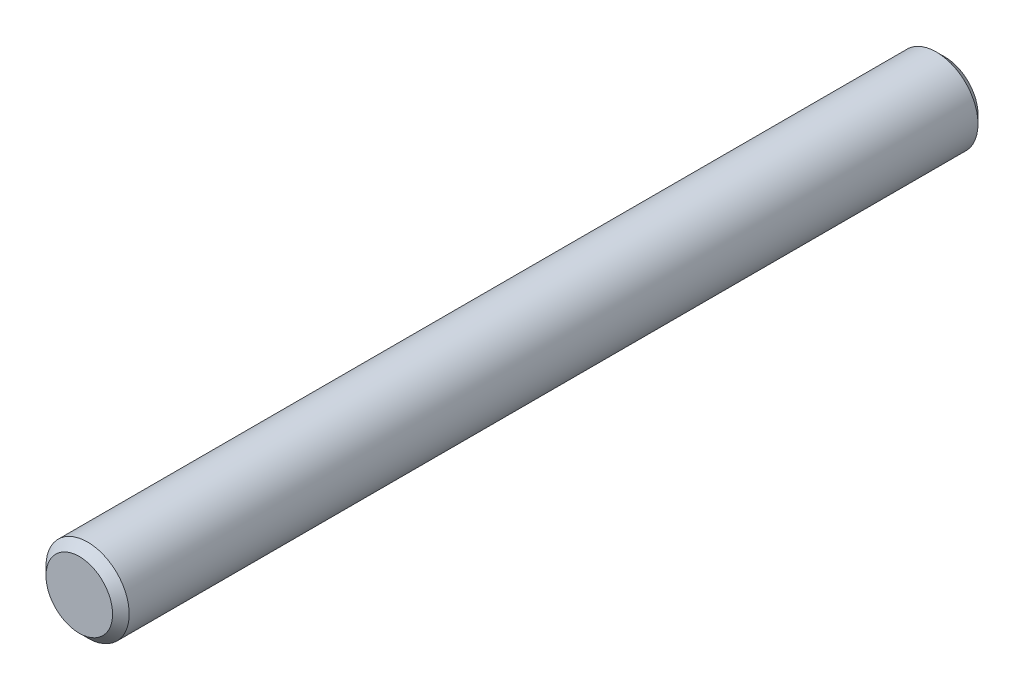
ISO-10303-21;
HEADER;
FILE_DESCRIPTION(('STEP AP214'),'2;1');
FILE_NAME('part.step','',(''),(''),'','','');
FILE_SCHEMA(('AUTOMOTIVE_DESIGN { 1 0 10303 214 1 1 1 1 }'));
ENDSEC;
DATA;
#1=APPLICATION_CONTEXT('core data for automotive mechanical design processes');
#2=APPLICATION_PROTOCOL_DEFINITION('international standard','automotive_design',2000,#1);
#3=PRODUCT_CONTEXT('',#1,'mechanical');
#4=PRODUCT('Part','Part','',(#3));
#5=PRODUCT_RELATED_PRODUCT_CATEGORY('part','',(#4));
#6=PRODUCT_DEFINITION_FORMATION('','',#4);
#7=PRODUCT_DEFINITION_CONTEXT('part definition',#1,'design');
#8=PRODUCT_DEFINITION('design','',#6,#7);
#9=PRODUCT_DEFINITION_SHAPE('','',#8);
#10=(LENGTH_UNIT() NAMED_UNIT(*) SI_UNIT(.MILLI.,.METRE.));
#11=(NAMED_UNIT(*) PLANE_ANGLE_UNIT() SI_UNIT($,.RADIAN.));
#12=(NAMED_UNIT(*) SI_UNIT($,.STERADIAN.) SOLID_ANGLE_UNIT());
#13=UNCERTAINTY_MEASURE_WITH_UNIT(LENGTH_MEASURE(1.E-05),#10,'distance_accuracy_value','');
#14=(GEOMETRIC_REPRESENTATION_CONTEXT(3) GLOBAL_UNCERTAINTY_ASSIGNED_CONTEXT((#13)) GLOBAL_UNIT_ASSIGNED_CONTEXT((#10,
#11,#12)) REPRESENTATION_CONTEXT('',''));
#15=CARTESIAN_POINT('',(0.,0.,0.));
#16=DIRECTION('',(0.,0.,1.));
#17=DIRECTION('',(1.,0.,0.));
#18=AXIS2_PLACEMENT_3D('',#15,#16,#17);
#19=CARTESIAN_POINT('',(0.,0.,52.));
#20=DIRECTION('',(0.,0.,-1.));
#21=DIRECTION('',(-1.,0.,0.));
#22=AXIS2_PLACEMENT_3D('',#19,#20,#21);
#23=CYLINDRICAL_SURFACE('',#22,2.5);
#24=CARTESIAN_POINT('',(0.,0.,51.5));
#25=DIRECTION('',(0.,0.,1.));
#26=DIRECTION('',(1.,0.,0.));
#27=AXIS2_PLACEMENT_3D('',#24,#25,#26);
#28=CIRCLE('',#27,2.5);
#29=CARTESIAN_POINT('',(-2.5,0.,51.5));
#30=VERTEX_POINT('',#29);
#31=EDGE_CURVE('E38',#30,#30,#28,.F.);
#32=CARTESIAN_POINT('',(0.,0.,0.500000000000021));
#33=DIRECTION('',(0.,0.,1.));
#34=DIRECTION('',(1.,0.,0.));
#35=AXIS2_PLACEMENT_3D('',#32,#33,#34);
#36=CIRCLE('',#35,2.5);
#37=CARTESIAN_POINT('',(-2.5,0.,0.500000000000014));
#38=VERTEX_POINT('',#37);
#39=EDGE_CURVE('E42',#38,#38,#36,.T.);
#40=CARTESIAN_POINT('',(-2.5,0.,51.5));
#41=CARTESIAN_POINT('',(-2.5,0.,50.96875));
#42=CARTESIAN_POINT('',(-2.5,0.,50.4375));
#43=CARTESIAN_POINT('',(-2.5,0.,49.375));
#44=CARTESIAN_POINT('',(-2.5,0.,48.84375));
#45=CARTESIAN_POINT('',(-2.5,0.,47.78125));
#46=CARTESIAN_POINT('',(-2.5,0.,47.25));
#47=CARTESIAN_POINT('',(-2.5,0.,46.1875));
#48=CARTESIAN_POINT('',(-2.5,0.,45.65625));
#49=CARTESIAN_POINT('',(-2.5,0.,44.59375));
#50=CARTESIAN_POINT('',(-2.5,0.,44.0625));
#51=CARTESIAN_POINT('',(-2.5,0.,43.));
#52=CARTESIAN_POINT('',(-2.5,0.,42.46875));
#53=CARTESIAN_POINT('',(-2.5,0.,41.40625));
#54=CARTESIAN_POINT('',(-2.5,0.,40.875));
#55=CARTESIAN_POINT('',(-2.5,0.,39.8125));
#56=CARTESIAN_POINT('',(-2.5,0.,39.28125));
#57=CARTESIAN_POINT('',(-2.5,0.,38.21875));
#58=CARTESIAN_POINT('',(-2.5,0.,37.6875));
#59=CARTESIAN_POINT('',(-2.5,0.,36.625));
#60=CARTESIAN_POINT('',(-2.5,0.,36.09375));
#61=CARTESIAN_POINT('',(-2.5,0.,35.03125));
#62=CARTESIAN_POINT('',(-2.5,0.,34.5));
#63=CARTESIAN_POINT('',(-2.5,0.,33.4375));
#64=CARTESIAN_POINT('',(-2.5,0.,32.90625));
#65=CARTESIAN_POINT('',(-2.5,0.,31.84375));
#66=CARTESIAN_POINT('',(-2.5,0.,31.3125));
#67=CARTESIAN_POINT('',(-2.5,0.,30.25));
#68=CARTESIAN_POINT('',(-2.5,0.,29.71875));
#69=CARTESIAN_POINT('',(-2.5,0.,28.65625));
#70=CARTESIAN_POINT('',(-2.5,0.,28.125));
#71=CARTESIAN_POINT('',(-2.5,0.,27.0625));
#72=CARTESIAN_POINT('',(-2.5,0.,26.53125));
#73=CARTESIAN_POINT('',(-2.5,0.,25.46875));
#74=CARTESIAN_POINT('',(-2.5,0.,24.9375));
#75=CARTESIAN_POINT('',(-2.5,0.,23.875));
#76=CARTESIAN_POINT('',(-2.5,0.,23.34375));
#77=CARTESIAN_POINT('',(-2.5,0.,22.28125));
#78=CARTESIAN_POINT('',(-2.5,0.,21.75));
#79=CARTESIAN_POINT('',(-2.5,0.,20.6875));
#80=CARTESIAN_POINT('',(-2.5,0.,20.15625));
#81=CARTESIAN_POINT('',(-2.5,0.,19.09375));
#82=CARTESIAN_POINT('',(-2.5,0.,18.5625));
#83=CARTESIAN_POINT('',(-2.5,0.,17.5));
#84=CARTESIAN_POINT('',(-2.5,0.,16.96875));
#85=CARTESIAN_POINT('',(-2.5,0.,15.90625));
#86=CARTESIAN_POINT('',(-2.5,0.,15.375));
#87=CARTESIAN_POINT('',(-2.5,0.,14.3125));
#88=CARTESIAN_POINT('',(-2.5,0.,13.78125));
#89=CARTESIAN_POINT('',(-2.5,0.,12.71875));
#90=CARTESIAN_POINT('',(-2.5,0.,12.1875));
#91=CARTESIAN_POINT('',(-2.5,0.,11.125));
#92=CARTESIAN_POINT('',(-2.5,0.,10.59375));
#93=CARTESIAN_POINT('',(-2.5,0.,9.53125000000002));
#94=CARTESIAN_POINT('',(-2.5,0.,9.00000000000002));
#95=CARTESIAN_POINT('',(-2.5,0.,7.93750000000002));
#96=CARTESIAN_POINT('',(-2.5,0.,7.40625000000001));
#97=CARTESIAN_POINT('',(-2.5,0.,6.34375000000001));
#98=CARTESIAN_POINT('',(-2.5,0.,5.81250000000002));
#99=CARTESIAN_POINT('',(-2.5,0.,4.75000000000002));
#100=CARTESIAN_POINT('',(-2.5,0.,4.21875000000002));
#101=CARTESIAN_POINT('',(-2.5,0.,3.15625000000002));
#102=CARTESIAN_POINT('',(-2.5,0.,2.62500000000001));
#103=CARTESIAN_POINT('',(-2.5,0.,1.56250000000001));
#104=CARTESIAN_POINT('',(-2.5,0.,1.03125000000001));
#105=CARTESIAN_POINT('',(-2.5,0.,0.500000000000014));
#106=B_SPLINE_CURVE_WITH_KNOTS('',3,(#40,#41,#42,#43,#44,#45,#46,#47,#48,#49,#50,#51,#52,#53,
#54,#55,#56,#57,#58,#59,#60,#61,#62,#63,#64,#65,#66,#67,#68,#69,#70,#71,#72,#73,#74,#75,#76,#77,
#78,#79,#80,#81,#82,#83,#84,#85,#86,#87,#88,#89,#90,#91,#92,#93,#94,#95,#96,#97,#98,#99,#100,
#101,#102,#103,#104,#105),.UNSPECIFIED.,.F.,.F.,(4,2,2,2,2,2,2,2,2,2,2,2,2,2,2,2,2,2,2,2,2,2,2,
2,2,2,2,2,2,2,2,2,4),(0.,1.59375,3.1875,4.78124999999999,6.375,7.96875,9.56249999999999,
11.15625,12.75,14.34375,15.9375,17.53125,19.125,20.71875,22.3125,23.90625,25.5,27.09375,28.6875,
30.28125,31.875,33.46875,35.0625,36.65625,38.25,39.84375,41.4375,43.03125,44.625,46.21875,
47.8125,49.40625,51.),.UNSPECIFIED.);
#107=EDGE_CURVE('BSEAM31',#30,#38,#106,.T.);
#108=ORIENTED_EDGE('',*,*,#31,.T.);
#109=ORIENTED_EDGE('',*,*,#39,.T.);
#110=ORIENTED_EDGE('',*,*,#107,.T.);
#111=ORIENTED_EDGE('',*,*,#107,.F.);
#112=EDGE_LOOP('',(#108,#110,#109,#111));
#113=FACE_BOUND('',#112,.T.);
#114=ADVANCED_FACE('F31',(#113),#23,.T.);
#115=CARTESIAN_POINT('',(0.,0.,52.));
#116=DIRECTION('',(0.,0.,1.));
#117=DIRECTION('',(1.,0.,0.));
#118=AXIS2_PLACEMENT_3D('',#115,#116,#117);
#119=PLANE('',#118);
#120=CARTESIAN_POINT('',(0.,0.,52.));
#121=DIRECTION('',(0.,0.,1.));
#122=DIRECTION('',(1.,0.,0.));
#123=AXIS2_PLACEMENT_3D('',#120,#121,#122);
#124=CIRCLE('',#123,2.00000000000003);
#125=CARTESIAN_POINT('',(2.00000000000003,0.,52.));
#126=VERTEX_POINT('',#125);
#127=EDGE_CURVE('E46',#126,#126,#124,.T.);
#128=ORIENTED_EDGE('',*,*,#127,.T.);
#129=EDGE_LOOP('',(#128));
#130=FACE_BOUND('',#129,.T.);
#131=ADVANCED_FACE('F52',(#130),#119,.T.);
#132=CARTESIAN_POINT('',(0.,0.,0.));
#133=DIRECTION('',(0.,0.,1.));
#134=DIRECTION('',(1.,0.,0.));
#135=AXIS2_PLACEMENT_3D('',#132,#133,#134);
#136=PLANE('',#135);
#137=CARTESIAN_POINT('',(0.,0.,0.));
#138=DIRECTION('',(0.,0.,1.));
#139=DIRECTION('',(1.,0.,0.));
#140=AXIS2_PLACEMENT_3D('',#137,#138,#139);
#141=CIRCLE('',#140,1.99999999999998);
#142=CARTESIAN_POINT('',(1.99999999999998,0.,0.));
#143=VERTEX_POINT('',#142);
#144=EDGE_CURVE('E10',#143,#143,#141,.F.);
#145=ORIENTED_EDGE('',*,*,#144,.T.);
#146=EDGE_LOOP('',(#145));
#147=FACE_BOUND('',#146,.T.);
#148=ADVANCED_FACE('F56',(#147),#136,.F.);
#149=CARTESIAN_POINT('',(0.,0.,52.));
#150=DIRECTION('',(0.,0.,-1.));
#151=DIRECTION('',(-1.,0.,0.));
#152=AXIS2_PLACEMENT_3D('',#149,#150,#151);
#153=CONICAL_SURFACE('',#152,2.00000000000003,0.78539816339744);
#154=ORIENTED_EDGE('',*,*,#31,.F.);
#155=EDGE_LOOP('',(#154));
#156=FACE_BOUND('',#155,.T.);
#157=ORIENTED_EDGE('',*,*,#127,.F.);
#158=EDGE_LOOP('',(#157));
#159=FACE_BOUND('',#158,.T.);
#160=ADVANCED_FACE('F54',(#156,#159),#153,.T.);
#161=CARTESIAN_POINT('',(0.,0.,0.500000000000021));
#162=DIRECTION('',(0.,0.,1.));
#163=DIRECTION('',(1.,0.,0.));
#164=AXIS2_PLACEMENT_3D('',#161,#162,#163);
#165=CONICAL_SURFACE('',#164,2.5,0.785398163397447);
#166=ORIENTED_EDGE('',*,*,#144,.F.);
#167=EDGE_LOOP('',(#166));
#168=FACE_BOUND('',#167,.T.);
#169=ORIENTED_EDGE('',*,*,#39,.F.);
#170=EDGE_LOOP('',(#169));
#171=FACE_BOUND('',#170,.T.);
#172=ADVANCED_FACE('F33',(#168,#171),#165,.T.);
#173=CLOSED_SHELL('',(#114,#131,#148,#160,#172));
#174=MANIFOLD_SOLID_BREP('B2',#173);
#175=ADVANCED_BREP_SHAPE_REPRESENTATION('',(#18,#174),#14);
#176=SHAPE_DEFINITION_REPRESENTATION(#9,#175);
ENDSEC;
END-ISO-10303-21;
